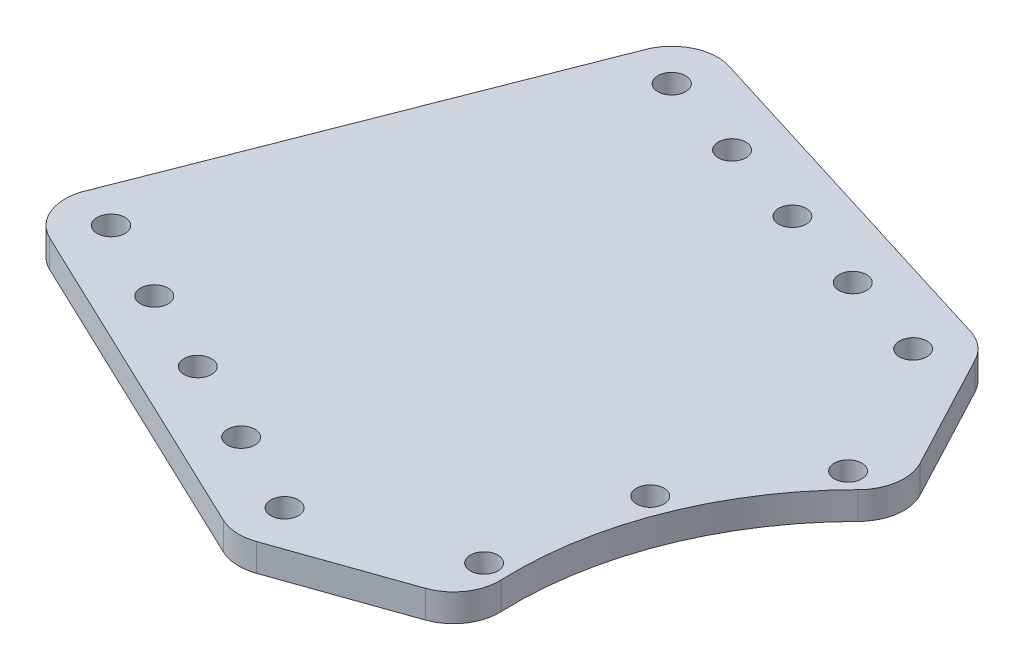
ISO-10303-21;
HEADER;
FILE_DESCRIPTION(('STEP AP214'),'2;1');
FILE_NAME('part.step','',(''),(''),'','','');
FILE_SCHEMA(('AUTOMOTIVE_DESIGN { 1 0 10303 214 1 1 1 1 }'));
ENDSEC;
DATA;
#1=APPLICATION_CONTEXT('core data for automotive mechanical design processes');
#2=APPLICATION_PROTOCOL_DEFINITION('international standard','automotive_design',2000,#1);
#3=PRODUCT_CONTEXT('',#1,'mechanical');
#4=PRODUCT('Part','Part','',(#3));
#5=PRODUCT_RELATED_PRODUCT_CATEGORY('part','',(#4));
#6=PRODUCT_DEFINITION_FORMATION('','',#4);
#7=PRODUCT_DEFINITION_CONTEXT('part definition',#1,'design');
#8=PRODUCT_DEFINITION('design','',#6,#7);
#9=PRODUCT_DEFINITION_SHAPE('','',#8);
#10=(LENGTH_UNIT() NAMED_UNIT(*) SI_UNIT(.MILLI.,.METRE.));
#11=(NAMED_UNIT(*) PLANE_ANGLE_UNIT() SI_UNIT($,.RADIAN.));
#12=(NAMED_UNIT(*) SI_UNIT($,.STERADIAN.) SOLID_ANGLE_UNIT());
#13=UNCERTAINTY_MEASURE_WITH_UNIT(LENGTH_MEASURE(1.E-05),#10,'distance_accuracy_value','');
#14=(GEOMETRIC_REPRESENTATION_CONTEXT(3) GLOBAL_UNCERTAINTY_ASSIGNED_CONTEXT((#13)) GLOBAL_UNIT_ASSIGNED_CONTEXT((#10,
#11,#12)) REPRESENTATION_CONTEXT('',''));
#15=CARTESIAN_POINT('',(0.,0.,0.));
#16=DIRECTION('',(0.,0.,1.));
#17=DIRECTION('',(1.,0.,0.));
#18=AXIS2_PLACEMENT_3D('',#15,#16,#17);
#19=CARTESIAN_POINT('',(-101.704945462718,-9.79999999999935,15.2700175783416));
#20=DIRECTION('',(0.,-1.,0.));
#21=DIRECTION('',(0.,0.,-1.));
#22=AXIS2_PLACEMENT_3D('',#19,#20,#21);
#23=PLANE('',#22);
#24=CARTESIAN_POINT('',(-101.704945462718,-9.79999999999935,15.2700175783416));
#25=DIRECTION('',(0.,1.,0.));
#26=DIRECTION('',(0.,0.,-1.));
#27=AXIS2_PLACEMENT_3D('',#24,#25,#26);
#28=CIRCLE('',#27,5.01371878754549);
#29=CARTESIAN_POINT('',(-106.232366673549,-9.79999999999935,13.1159903593145));
#30=VERTEX_POINT('',#29);
#31=CARTESIAN_POINT('',(-103.858972681745,-9.79999999999935,19.797438789172));
#32=VERTEX_POINT('',#31);
#33=EDGE_CURVE('E187',#30,#32,#28,.T.);
#34=ORIENTED_EDGE('',*,*,#33,.T.);
#35=DIRECTION('',(0.903006610996398,0.,0.429626652451637));
#36=VECTOR('',#35,1.);
#37=CARTESIAN_POINT('',(-67.7502115294627,-9.79999999999932,36.9770319273808));
#38=LINE('',#37,#36);
#39=CARTESIAN_POINT('',(-67.7502115294627,-9.79999999999932,36.9770319273808));
#40=VERTEX_POINT('',#39);
#41=EDGE_CURVE('E115',#32,#40,#38,.T.);
#42=ORIENTED_EDGE('',*,*,#41,.T.);
#43=CARTESIAN_POINT('',(-65.6020782672045,-9.79999999999932,32.4619988723989));
#44=DIRECTION('',(0.,1.,0.));
#45=DIRECTION('',(0.,0.,-1.));
#46=AXIS2_PLACEMENT_3D('',#43,#44,#45);
#47=CIRCLE('',#46,4.99999999999995);
#48=CARTESIAN_POINT('',(-63.9420227974751,-9.79999999999932,37.1783762785678));
#49=VERTEX_POINT('',#48);
#50=EDGE_CURVE('E214',#40,#49,#47,.T.);
#51=ORIENTED_EDGE('',*,*,#50,.T.);
#52=DIRECTION('',(0.9432754812338,0.,-0.332011093945885));
#53=VECTOR('',#52,1.);
#54=CARTESIAN_POINT('',(-50.3329893663854,-9.79999999999932,32.38831211715));
#55=LINE('',#54,#53);
#56=CARTESIAN_POINT('',(-50.3329893663854,-9.79999999999932,32.38831211715));
#57=VERTEX_POINT('',#56);
#58=EDGE_CURVE('E233',#49,#57,#55,.T.);
#59=ORIENTED_EDGE('',*,*,#58,.T.);
#60=CARTESIAN_POINT('',(-51.993044836116,-9.79999999999932,27.6719347109777));
#61=DIRECTION('',(0.,1.,0.));
#62=DIRECTION('',(0.,0.,-1.));
#63=AXIS2_PLACEMENT_3D('',#60,#61,#62);
#64=CIRCLE('',#63,5.0000000000035);
#65=CARTESIAN_POINT('',(-46.9968982868011,-9.79999999999932,27.4756704559436));
#66=VERTEX_POINT('',#65);
#67=EDGE_CURVE('E230',#57,#66,#64,.T.);
#68=ORIENTED_EDGE('',*,*,#67,.T.);
#69=CARTESIAN_POINT('',(-9.52579916696577,-9.79999999999931,26.0036885431889));
#70=DIRECTION('',(0.,-1.,0.));
#71=DIRECTION('',(0.,0.,1.));
#72=AXIS2_PLACEMENT_3D('',#69,#70,#71);
#73=CIRCLE('',#72,37.5000000000001);
#74=CARTESIAN_POINT('',(-36.0579854869404,-9.79999999999934,-0.497124445890421));
#75=VERTEX_POINT('',#74);
#76=EDGE_CURVE('E232',#66,#75,#73,.T.);
#77=ORIENTED_EDGE('',*,*,#76,.T.);
#78=CARTESIAN_POINT('',(-39.5956103296037,-9.79999999999935,-4.03056617776767));
#79=DIRECTION('',(0.,1.,0.));
#80=DIRECTION('',(0.,0.,-1.));
#81=AXIS2_PLACEMENT_3D('',#78,#79,#80);
#82=CIRCLE('',#81,5.00000000000003);
#83=CARTESIAN_POINT('',(-35.1764804281203,-9.79999999999935,-6.36964525163757));
#84=VERTEX_POINT('',#83);
#85=EDGE_CURVE('E235',#75,#84,#82,.T.);
#86=ORIENTED_EDGE('',*,*,#85,.T.);
#87=DIRECTION('',(-0.467815814773978,0.,-0.883825980296664));
#88=VECTOR('',#87,1.);
#89=CARTESIAN_POINT('',(-41.9258566066734,-9.79999999999936,-19.1209756449521));
#90=LINE('',#89,#88);
#91=CARTESIAN_POINT('',(-41.9258566066734,-9.79999999999936,-19.1209756449521));
#92=VERTEX_POINT('',#91);
#93=EDGE_CURVE('E241',#84,#92,#90,.T.);
#94=ORIENTED_EDGE('',*,*,#93,.T.);
#95=CARTESIAN_POINT('',(-46.3449865081567,-9.79999999999936,-16.7818965710823));
#96=DIRECTION('',(0.,1.,0.));
#97=DIRECTION('',(0.,0.,-1.));
#98=AXIS2_PLACEMENT_3D('',#95,#96,#97);
#99=CIRCLE('',#98,4.99999999999996);
#100=CARTESIAN_POINT('',(-44.8603922919088,-9.79999999999936,-21.5564101602432));
#101=VERTEX_POINT('',#100);
#102=EDGE_CURVE('E146',#92,#101,#99,.T.);
#103=ORIENTED_EDGE('',*,*,#102,.T.);
#104=DIRECTION('',(-0.9549027178322,0.,-0.296918843249594));
#105=VECTOR('',#104,1.);
#106=CARTESIAN_POINT('',(-83.044336619652,-9.79999999999939,-33.4293814784511));
#107=LINE('',#106,#105);
#108=CARTESIAN_POINT('',(-83.044336619652,-9.79999999999939,-33.4293814784511));
#109=VERTEX_POINT('',#108);
#110=EDGE_CURVE('E140',#101,#109,#107,.T.);
#111=ORIENTED_EDGE('',*,*,#110,.T.);
#112=CARTESIAN_POINT('',(-84.5289308359,-9.79999999999938,-28.6548678892901));
#113=DIRECTION('',(0.,1.,0.));
#114=DIRECTION('',(0.,0.,-1.));
#115=AXIS2_PLACEMENT_3D('',#112,#113,#114);
#116=CIRCLE('',#115,5.);
#117=CARTESIAN_POINT('',(-89.185537994532,-9.79999999999939,-30.4758593143596));
#118=VERTEX_POINT('',#117);
#119=EDGE_CURVE('E144',#109,#118,#116,.T.);
#120=ORIENTED_EDGE('',*,*,#119,.T.);
#121=DIRECTION('',(-0.364198285013916,0.,0.931321431726406));
#122=VECTOR('',#121,1.);
#123=CARTESIAN_POINT('',(-106.232366673549,-9.79999999999935,13.1159903593145));
#124=LINE('',#123,#122);
#125=EDGE_CURVE('E60',#118,#30,#124,.T.);
#126=ORIENTED_EDGE('',*,*,#125,.T.);
#127=EDGE_LOOP('',(#34,#42,#51,#59,#68,#77,#86,#94,#103,#111,#120,#126));
#128=FACE_BOUND('',#127,.T.);
#129=CARTESIAN_POINT('',(-65.6020782672045,-9.79999999999932,32.4619988723989));
#130=DIRECTION('',(0.,1.,0.));
#131=DIRECTION('',(0.,0.,1.));
#132=AXIS2_PLACEMENT_3D('',#129,#130,#131);
#133=CIRCLE('',#132,1.50000000000001);
#134=CARTESIAN_POINT('',(-65.6020782672045,-9.79999999999932,33.9619988723989));
#135=VERTEX_POINT('',#134);
#136=EDGE_CURVE('E168',#135,#135,#133,.T.);
#137=ORIENTED_EDGE('',*,*,#136,.F.);
#138=EDGE_LOOP('',(#137));
#139=FACE_BOUND('',#138,.T.);
#140=CARTESIAN_POINT('',(-74.6321443771685,-9.79999999999933,28.1657323478825));
#141=DIRECTION('',(0.,1.,0.));
#142=DIRECTION('',(0.,0.,1.));
#143=AXIS2_PLACEMENT_3D('',#140,#141,#142);
#144=CIRCLE('',#143,1.49999999999998);
#145=CARTESIAN_POINT('',(-74.6321443771685,-9.79999999999933,29.6657323478824));
#146=VERTEX_POINT('',#145);
#147=EDGE_CURVE('E395',#146,#146,#144,.T.);
#148=ORIENTED_EDGE('',*,*,#147,.F.);
#149=EDGE_LOOP('',(#148));
#150=FACE_BOUND('',#149,.T.);
#151=CARTESIAN_POINT('',(-83.6622104871345,-9.79999999999934,23.8694658233717));
#152=DIRECTION('',(0.,1.,0.));
#153=DIRECTION('',(0.,0.,1.));
#154=AXIS2_PLACEMENT_3D('',#151,#152,#153);
#155=CIRCLE('',#154,1.49999999999936);
#156=CARTESIAN_POINT('',(-83.6622104871345,-9.79999999999933,25.3694658233711));
#157=VERTEX_POINT('',#156);
#158=EDGE_CURVE('E389',#157,#157,#155,.T.);
#159=ORIENTED_EDGE('',*,*,#158,.F.);
#160=EDGE_LOOP('',(#159));
#161=FACE_BOUND('',#160,.T.);
#162=CARTESIAN_POINT('',(-92.6922765970965,-9.79999999999934,19.5731992988497));
#163=DIRECTION('',(0.,1.,0.));
#164=DIRECTION('',(0.,0.,1.));
#165=AXIS2_PLACEMENT_3D('',#162,#163,#164);
#166=CIRCLE('',#165,1.50000000000003);
#167=CARTESIAN_POINT('',(-92.6922765970965,-9.79999999999934,21.0731992988497));
#168=VERTEX_POINT('',#167);
#169=EDGE_CURVE('E383',#168,#168,#166,.T.);
#170=ORIENTED_EDGE('',*,*,#169,.F.);
#171=EDGE_LOOP('',(#170));
#172=FACE_BOUND('',#171,.T.);
#173=CARTESIAN_POINT('',(-101.704945462718,-9.79999999999935,15.2700175783416));
#174=DIRECTION('',(0.,1.,0.));
#175=DIRECTION('',(0.,0.,1.));
#176=AXIS2_PLACEMENT_3D('',#173,#174,#175);
#177=CIRCLE('',#176,1.51872121914577);
#178=CARTESIAN_POINT('',(-101.704945462718,-9.79999999999935,16.7887387974874));
#179=VERTEX_POINT('',#178);
#180=EDGE_CURVE('E377',#179,#179,#177,.T.);
#181=ORIENTED_EDGE('',*,*,#180,.F.);
#182=EDGE_LOOP('',(#181));
#183=FACE_BOUND('',#182,.T.);
#184=CARTESIAN_POINT('',(-84.5289308359,-9.79999999999938,-28.6548678892901));
#185=DIRECTION('',(0.,1.,0.));
#186=DIRECTION('',(0.,0.,1.));
#187=AXIS2_PLACEMENT_3D('',#184,#185,#186);
#188=CIRCLE('',#187,1.5127388741467);
#189=CARTESIAN_POINT('',(-84.5289308359,-9.79999999999938,-27.1421290151434));
#190=VERTEX_POINT('',#189);
#191=EDGE_CURVE('E371',#190,#190,#188,.T.);
#192=ORIENTED_EDGE('',*,*,#191,.F.);
#193=EDGE_LOOP('',(#192));
#194=FACE_BOUND('',#193,.T.);
#195=CARTESIAN_POINT('',(-74.9920680431228,-9.79999999999938,-25.6894618685701));
#196=DIRECTION('',(0.,1.,0.));
#197=DIRECTION('',(0.,0.,1.));
#198=AXIS2_PLACEMENT_3D('',#195,#196,#197);
#199=CIRCLE('',#198,1.5);
#200=CARTESIAN_POINT('',(-74.9920680431228,-9.79999999999938,-24.1894618685701));
#201=VERTEX_POINT('',#200);
#202=EDGE_CURVE('E365',#201,#201,#199,.T.);
#203=ORIENTED_EDGE('',*,*,#202,.F.);
#204=EDGE_LOOP('',(#203));
#205=FACE_BOUND('',#204,.T.);
#206=CARTESIAN_POINT('',(-65.4430408648008,-9.79999999999937,-22.7202734360741));
#207=DIRECTION('',(0.,1.,0.));
#208=DIRECTION('',(0.,0.,1.));
#209=AXIS2_PLACEMENT_3D('',#206,#207,#208);
#210=CIRCLE('',#209,1.5);
#211=CARTESIAN_POINT('',(-65.4430408648008,-9.79999999999937,-21.2202734360741));
#212=VERTEX_POINT('',#211);
#213=EDGE_CURVE('E359',#212,#212,#210,.T.);
#214=ORIENTED_EDGE('',*,*,#213,.F.);
#215=EDGE_LOOP('',(#214));
#216=FACE_BOUND('',#215,.T.);
#217=CARTESIAN_POINT('',(-55.8940136864788,-9.79999999999937,-19.7510850035782));
#218=DIRECTION('',(0.,1.,0.));
#219=DIRECTION('',(0.,0.,1.));
#220=AXIS2_PLACEMENT_3D('',#217,#218,#219);
#221=CIRCLE('',#220,1.5);
#222=CARTESIAN_POINT('',(-55.8940136864788,-9.79999999999937,-18.2510850035782));
#223=VERTEX_POINT('',#222);
#224=EDGE_CURVE('E353',#223,#223,#221,.T.);
#225=ORIENTED_EDGE('',*,*,#224,.F.);
#226=EDGE_LOOP('',(#225));
#227=FACE_BOUND('',#226,.T.);
#228=CARTESIAN_POINT('',(-46.3449865081567,-9.79999999999936,-16.7818965710823));
#229=DIRECTION('',(0.,1.,0.));
#230=DIRECTION('',(0.,0.,1.));
#231=AXIS2_PLACEMENT_3D('',#228,#229,#230);
#232=CIRCLE('',#231,1.50000000000001);
#233=CARTESIAN_POINT('',(-46.3449865081567,-9.79999999999936,-15.2818965710822));
#234=VERTEX_POINT('',#233);
#235=EDGE_CURVE('E347',#234,#234,#232,.T.);
#236=ORIENTED_EDGE('',*,*,#235,.F.);
#237=EDGE_LOOP('',(#236));
#238=FACE_BOUND('',#237,.T.);
#239=CARTESIAN_POINT('',(-38.3680455345854,-9.79999999999935,-1.71137639394458));
#240=DIRECTION('',(0.,1.,0.));
#241=DIRECTION('',(0.,0.,1.));
#242=AXIS2_PLACEMENT_3D('',#239,#240,#241);
#243=CIRCLE('',#242,1.5);
#244=CARTESIAN_POINT('',(-38.3680455345854,-9.79999999999935,-0.211376393944582));
#245=VERTEX_POINT('',#244);
#246=EDGE_CURVE('E341',#245,#245,#243,.T.);
#247=ORIENTED_EDGE('',*,*,#246,.F.);
#248=EDGE_LOOP('',(#247));
#249=FACE_BOUND('',#248,.T.);
#250=CARTESIAN_POINT('',(-46.7786564360212,-9.79999999999934,11.4357571426303));
#251=DIRECTION('',(0.,1.,0.));
#252=DIRECTION('',(0.,0.,1.));
#253=AXIS2_PLACEMENT_3D('',#250,#251,#252);
#254=CIRCLE('',#253,1.49999999999923);
#255=CARTESIAN_POINT('',(-46.7786564360212,-9.79999999999933,12.9357571426296));
#256=VERTEX_POINT('',#255);
#257=EDGE_CURVE('E335',#256,#256,#254,.T.);
#258=ORIENTED_EDGE('',*,*,#257,.F.);
#259=EDGE_LOOP('',(#258));
#260=FACE_BOUND('',#259,.T.);
#261=CARTESIAN_POINT('',(-49.5178575162354,-9.79999999999932,26.8007261763127));
#262=DIRECTION('',(0.,1.,0.));
#263=DIRECTION('',(0.,0.,1.));
#264=AXIS2_PLACEMENT_3D('',#261,#262,#263);
#265=CIRCLE('',#264,1.49999999999991);
#266=CARTESIAN_POINT('',(-49.5178575162354,-9.79999999999932,28.3007261763127));
#267=VERTEX_POINT('',#266);
#268=EDGE_CURVE('E326',#267,#267,#265,.T.);
#269=ORIENTED_EDGE('',*,*,#268,.F.);
#270=EDGE_LOOP('',(#269));
#271=FACE_BOUND('',#270,.T.);
#272=ADVANCED_FACE('F43',(#128,#139,#150,#161,#172,#183,#194,#205,#216,#227,#238,#249,#260,
#271),#23,.F.);
#273=CARTESIAN_POINT('',(-101.704945462718,-12.7999999999994,15.2700175783416));
#274=DIRECTION('',(0.,-1.,0.));
#275=DIRECTION('',(0.,0.,-1.));
#276=AXIS2_PLACEMENT_3D('',#273,#274,#275);
#277=PLANE('',#276);
#278=CARTESIAN_POINT('',(-46.7786564360212,-12.7999999999993,11.4357571426303));
#279=DIRECTION('',(0.,1.,0.));
#280=DIRECTION('',(0.,0.,1.));
#281=AXIS2_PLACEMENT_3D('',#278,#279,#280);
#282=CIRCLE('',#281,1.49999999999923);
#283=CARTESIAN_POINT('',(-46.7786564360212,-12.7999999999993,12.9357571426296));
#284=VERTEX_POINT('',#283);
#285=EDGE_CURVE('E332',#284,#284,#282,.T.);
#286=ORIENTED_EDGE('',*,*,#285,.T.);
#287=EDGE_LOOP('',(#286));
#288=FACE_BOUND('',#287,.T.);
#289=CARTESIAN_POINT('',(-46.3449865081567,-12.7999999999994,-16.7818965710823));
#290=DIRECTION('',(0.,1.,0.));
#291=DIRECTION('',(0.,0.,1.));
#292=AXIS2_PLACEMENT_3D('',#289,#290,#291);
#293=CIRCLE('',#292,1.50000000000001);
#294=CARTESIAN_POINT('',(-46.3449865081567,-12.7999999999994,-15.2818965710822));
#295=VERTEX_POINT('',#294);
#296=EDGE_CURVE('E344',#295,#295,#293,.T.);
#297=ORIENTED_EDGE('',*,*,#296,.T.);
#298=EDGE_LOOP('',(#297));
#299=FACE_BOUND('',#298,.T.);
#300=CARTESIAN_POINT('',(-65.4430408648008,-12.7999999999994,-22.7202734360741));
#301=DIRECTION('',(0.,1.,0.));
#302=DIRECTION('',(0.,0.,1.));
#303=AXIS2_PLACEMENT_3D('',#300,#301,#302);
#304=CIRCLE('',#303,1.5);
#305=CARTESIAN_POINT('',(-65.4430408648008,-12.7999999999994,-21.2202734360741));
#306=VERTEX_POINT('',#305);
#307=EDGE_CURVE('E356',#306,#306,#304,.T.);
#308=ORIENTED_EDGE('',*,*,#307,.T.);
#309=EDGE_LOOP('',(#308));
#310=FACE_BOUND('',#309,.T.);
#311=CARTESIAN_POINT('',(-84.5289308359,-12.7999999999994,-28.6548678892901));
#312=DIRECTION('',(0.,1.,0.));
#313=DIRECTION('',(0.,0.,1.));
#314=AXIS2_PLACEMENT_3D('',#311,#312,#313);
#315=CIRCLE('',#314,1.5127388741467);
#316=CARTESIAN_POINT('',(-84.5289308359,-12.7999999999994,-27.1421290151434));
#317=VERTEX_POINT('',#316);
#318=EDGE_CURVE('E368',#317,#317,#315,.T.);
#319=ORIENTED_EDGE('',*,*,#318,.T.);
#320=EDGE_LOOP('',(#319));
#321=FACE_BOUND('',#320,.T.);
#322=CARTESIAN_POINT('',(-92.6922765970965,-12.7999999999993,19.5731992988497));
#323=DIRECTION('',(0.,1.,0.));
#324=DIRECTION('',(0.,0.,1.));
#325=AXIS2_PLACEMENT_3D('',#322,#323,#324);
#326=CIRCLE('',#325,1.50000000000003);
#327=CARTESIAN_POINT('',(-92.6922765970965,-12.7999999999993,21.0731992988497));
#328=VERTEX_POINT('',#327);
#329=EDGE_CURVE('E380',#328,#328,#326,.T.);
#330=ORIENTED_EDGE('',*,*,#329,.T.);
#331=EDGE_LOOP('',(#330));
#332=FACE_BOUND('',#331,.T.);
#333=CARTESIAN_POINT('',(-74.6321443771685,-12.7999999999993,28.1657323478825));
#334=DIRECTION('',(0.,1.,0.));
#335=DIRECTION('',(0.,0.,1.));
#336=AXIS2_PLACEMENT_3D('',#333,#334,#335);
#337=CIRCLE('',#336,1.49999999999998);
#338=CARTESIAN_POINT('',(-74.6321443771685,-12.7999999999993,29.6657323478825));
#339=VERTEX_POINT('',#338);
#340=EDGE_CURVE('E392',#339,#339,#337,.T.);
#341=ORIENTED_EDGE('',*,*,#340,.T.);
#342=EDGE_LOOP('',(#341));
#343=FACE_BOUND('',#342,.T.);
#344=CARTESIAN_POINT('',(-101.704945462718,-12.7999999999994,15.2700175783416));
#345=DIRECTION('',(0.,1.,0.));
#346=DIRECTION('',(0.,0.,-1.));
#347=AXIS2_PLACEMENT_3D('',#344,#345,#346);
#348=CIRCLE('',#347,5.01371878754549);
#349=CARTESIAN_POINT('',(-106.232366673549,-12.7999999999994,13.1159903593145));
#350=VERTEX_POINT('',#349);
#351=CARTESIAN_POINT('',(-103.858972681745,-12.7999999999993,19.797438789172));
#352=VERTEX_POINT('',#351);
#353=EDGE_CURVE('E164',#350,#352,#348,.T.);
#354=ORIENTED_EDGE('',*,*,#353,.F.);
#355=DIRECTION('',(-0.364198285013916,0.,0.931321431726406));
#356=VECTOR('',#355,1.);
#357=CARTESIAN_POINT('',(-106.232366673549,-12.7999999999994,13.1159903593145));
#358=LINE('',#357,#356);
#359=CARTESIAN_POINT('',(-89.185537994532,-12.7999999999994,-30.4758593143596));
#360=VERTEX_POINT('',#359);
#361=EDGE_CURVE('E107',#360,#350,#358,.T.);
#362=ORIENTED_EDGE('',*,*,#361,.F.);
#363=CARTESIAN_POINT('',(-84.5289308359,-12.7999999999994,-28.6548678892901));
#364=DIRECTION('',(0.,1.,0.));
#365=DIRECTION('',(0.,0.,-1.));
#366=AXIS2_PLACEMENT_3D('',#363,#364,#365);
#367=CIRCLE('',#366,5.);
#368=CARTESIAN_POINT('',(-83.044336619652,-12.7999999999994,-33.4293814784511));
#369=VERTEX_POINT('',#368);
#370=EDGE_CURVE('E101',#369,#360,#367,.T.);
#371=ORIENTED_EDGE('',*,*,#370,.F.);
#372=DIRECTION('',(-0.9549027178322,0.,-0.296918843249594));
#373=VECTOR('',#372,1.);
#374=CARTESIAN_POINT('',(-83.044336619652,-12.7999999999994,-33.4293814784511));
#375=LINE('',#374,#373);
#376=CARTESIAN_POINT('',(-44.8603922919088,-12.7999999999994,-21.5564101602432));
#377=VERTEX_POINT('',#376);
#378=EDGE_CURVE('E154',#377,#369,#375,.T.);
#379=ORIENTED_EDGE('',*,*,#378,.F.);
#380=CARTESIAN_POINT('',(-46.3449865081567,-12.7999999999994,-16.7818965710823));
#381=DIRECTION('',(0.,1.,0.));
#382=DIRECTION('',(0.,0.,-1.));
#383=AXIS2_PLACEMENT_3D('',#380,#381,#382);
#384=CIRCLE('',#383,4.99999999999996);
#385=CARTESIAN_POINT('',(-41.9258566066734,-12.7999999999994,-19.1209756449521));
#386=VERTEX_POINT('',#385);
#387=EDGE_CURVE('E182',#386,#377,#384,.T.);
#388=ORIENTED_EDGE('',*,*,#387,.F.);
#389=DIRECTION('',(-0.467815814773978,0.,-0.883825980296664));
#390=VECTOR('',#389,1.);
#391=CARTESIAN_POINT('',(-41.9258566066734,-12.7999999999994,-19.1209756449521));
#392=LINE('',#391,#390);
#393=CARTESIAN_POINT('',(-35.1764804281203,-12.7999999999994,-6.36964525163757));
#394=VERTEX_POINT('',#393);
#395=EDGE_CURVE('E180',#394,#386,#392,.T.);
#396=ORIENTED_EDGE('',*,*,#395,.F.);
#397=CARTESIAN_POINT('',(-39.5956103296037,-12.7999999999993,-4.03056617776767));
#398=DIRECTION('',(0.,1.,0.));
#399=DIRECTION('',(0.,0.,-1.));
#400=AXIS2_PLACEMENT_3D('',#397,#398,#399);
#401=CIRCLE('',#400,5.00000000000003);
#402=CARTESIAN_POINT('',(-36.0579854869404,-12.7999999999993,-0.497124445890418));
#403=VERTEX_POINT('',#402);
#404=EDGE_CURVE('E178',#403,#394,#401,.T.);
#405=ORIENTED_EDGE('',*,*,#404,.F.);
#406=CARTESIAN_POINT('',(-9.52579916696577,-12.7999999999993,26.0036885431889));
#407=DIRECTION('',(0.,-1.,0.));
#408=DIRECTION('',(0.,0.,1.));
#409=AXIS2_PLACEMENT_3D('',#406,#407,#408);
#410=CIRCLE('',#409,37.5000000000001);
#411=CARTESIAN_POINT('',(-46.9968982868011,-12.7999999999993,27.4756704559436));
#412=VERTEX_POINT('',#411);
#413=EDGE_CURVE('E176',#412,#403,#410,.T.);
#414=ORIENTED_EDGE('',*,*,#413,.F.);
#415=CARTESIAN_POINT('',(-51.993044836116,-12.7999999999993,27.6719347109777));
#416=DIRECTION('',(0.,1.,0.));
#417=DIRECTION('',(0.,0.,-1.));
#418=AXIS2_PLACEMENT_3D('',#415,#416,#417);
#419=CIRCLE('',#418,5.0000000000035);
#420=CARTESIAN_POINT('',(-50.3329893663854,-12.7999999999993,32.38831211715));
#421=VERTEX_POINT('',#420);
#422=EDGE_CURVE('E174',#421,#412,#419,.T.);
#423=ORIENTED_EDGE('',*,*,#422,.F.);
#424=DIRECTION('',(0.9432754812338,0.,-0.332011093945885));
#425=VECTOR('',#424,1.);
#426=CARTESIAN_POINT('',(-50.3329893663854,-12.7999999999993,32.38831211715));
#427=LINE('',#426,#425);
#428=CARTESIAN_POINT('',(-63.9420227974751,-12.7999999999993,37.1783762785678));
#429=VERTEX_POINT('',#428);
#430=EDGE_CURVE('E172',#429,#421,#427,.T.);
#431=ORIENTED_EDGE('',*,*,#430,.F.);
#432=CARTESIAN_POINT('',(-65.6020782672045,-12.7999999999993,32.4619988723989));
#433=DIRECTION('',(0.,1.,0.));
#434=DIRECTION('',(0.,0.,-1.));
#435=AXIS2_PLACEMENT_3D('',#432,#433,#434);
#436=CIRCLE('',#435,4.99999999999995);
#437=CARTESIAN_POINT('',(-67.7502115294627,-12.7999999999993,36.9770319273808));
#438=VERTEX_POINT('',#437);
#439=EDGE_CURVE('E170',#438,#429,#436,.T.);
#440=ORIENTED_EDGE('',*,*,#439,.F.);
#441=DIRECTION('',(0.903006610996398,0.,0.429626652451637));
#442=VECTOR('',#441,1.);
#443=CARTESIAN_POINT('',(-67.7502115294627,-12.7999999999993,36.9770319273808));
#444=LINE('',#443,#442);
#445=EDGE_CURVE('E167',#352,#438,#444,.T.);
#446=ORIENTED_EDGE('',*,*,#445,.F.);
#447=EDGE_LOOP('',(#354,#362,#371,#379,#388,#396,#405,#414,#423,#431,#440,#446));
#448=FACE_BOUND('',#447,.T.);
#449=CARTESIAN_POINT('',(-65.6020782672045,-12.7999999999993,32.4619988723989));
#450=DIRECTION('',(0.,1.,0.));
#451=DIRECTION('',(0.,0.,1.));
#452=AXIS2_PLACEMENT_3D('',#449,#450,#451);
#453=CIRCLE('',#452,1.50000000000001);
#454=CARTESIAN_POINT('',(-65.6020782672045,-12.7999999999993,33.9619988723989));
#455=VERTEX_POINT('',#454);
#456=EDGE_CURVE('E398',#455,#455,#453,.T.);
#457=ORIENTED_EDGE('',*,*,#456,.T.);
#458=EDGE_LOOP('',(#457));
#459=FACE_BOUND('',#458,.T.);
#460=CARTESIAN_POINT('',(-83.6622104871345,-12.7999999999993,23.8694658233717));
#461=DIRECTION('',(0.,1.,0.));
#462=DIRECTION('',(0.,0.,1.));
#463=AXIS2_PLACEMENT_3D('',#460,#461,#462);
#464=CIRCLE('',#463,1.49999999999936);
#465=CARTESIAN_POINT('',(-83.6622104871345,-12.7999999999993,25.3694658233711));
#466=VERTEX_POINT('',#465);
#467=EDGE_CURVE('E386',#466,#466,#464,.T.);
#468=ORIENTED_EDGE('',*,*,#467,.T.);
#469=EDGE_LOOP('',(#468));
#470=FACE_BOUND('',#469,.T.);
#471=CARTESIAN_POINT('',(-101.704945462718,-12.7999999999994,15.2700175783416));
#472=DIRECTION('',(0.,1.,0.));
#473=DIRECTION('',(0.,0.,1.));
#474=AXIS2_PLACEMENT_3D('',#471,#472,#473);
#475=CIRCLE('',#474,1.51872121914577);
#476=CARTESIAN_POINT('',(-101.704945462718,-12.7999999999993,16.7887387974874));
#477=VERTEX_POINT('',#476);
#478=EDGE_CURVE('E374',#477,#477,#475,.T.);
#479=ORIENTED_EDGE('',*,*,#478,.T.);
#480=EDGE_LOOP('',(#479));
#481=FACE_BOUND('',#480,.T.);
#482=CARTESIAN_POINT('',(-74.9920680431228,-12.7999999999994,-25.6894618685701));
#483=DIRECTION('',(0.,1.,0.));
#484=DIRECTION('',(0.,0.,1.));
#485=AXIS2_PLACEMENT_3D('',#482,#483,#484);
#486=CIRCLE('',#485,1.5);
#487=CARTESIAN_POINT('',(-74.9920680431228,-12.7999999999994,-24.1894618685701));
#488=VERTEX_POINT('',#487);
#489=EDGE_CURVE('E362',#488,#488,#486,.T.);
#490=ORIENTED_EDGE('',*,*,#489,.T.);
#491=EDGE_LOOP('',(#490));
#492=FACE_BOUND('',#491,.T.);
#493=CARTESIAN_POINT('',(-55.8940136864788,-12.7999999999994,-19.7510850035782));
#494=DIRECTION('',(0.,1.,0.));
#495=DIRECTION('',(0.,0.,1.));
#496=AXIS2_PLACEMENT_3D('',#493,#494,#495);
#497=CIRCLE('',#496,1.5);
#498=CARTESIAN_POINT('',(-55.8940136864788,-12.7999999999994,-18.2510850035782));
#499=VERTEX_POINT('',#498);
#500=EDGE_CURVE('E350',#499,#499,#497,.T.);
#501=ORIENTED_EDGE('',*,*,#500,.T.);
#502=EDGE_LOOP('',(#501));
#503=FACE_BOUND('',#502,.T.);
#504=CARTESIAN_POINT('',(-38.3680455345854,-12.7999999999993,-1.71137639394458));
#505=DIRECTION('',(0.,1.,0.));
#506=DIRECTION('',(0.,0.,1.));
#507=AXIS2_PLACEMENT_3D('',#504,#505,#506);
#508=CIRCLE('',#507,1.5);
#509=CARTESIAN_POINT('',(-38.3680455345854,-12.7999999999993,-0.211376393944579));
#510=VERTEX_POINT('',#509);
#511=EDGE_CURVE('E338',#510,#510,#508,.T.);
#512=ORIENTED_EDGE('',*,*,#511,.T.);
#513=EDGE_LOOP('',(#512));
#514=FACE_BOUND('',#513,.T.);
#515=CARTESIAN_POINT('',(-49.5178575162354,-12.7999999999993,26.8007261763127));
#516=DIRECTION('',(0.,1.,0.));
#517=DIRECTION('',(0.,0.,1.));
#518=AXIS2_PLACEMENT_3D('',#515,#516,#517);
#519=CIRCLE('',#518,1.49999999999991);
#520=CARTESIAN_POINT('',(-49.5178575162354,-12.7999999999993,28.3007261763127));
#521=VERTEX_POINT('',#520);
#522=EDGE_CURVE('E329',#521,#521,#519,.T.);
#523=ORIENTED_EDGE('',*,*,#522,.T.);
#524=EDGE_LOOP('',(#523));
#525=FACE_BOUND('',#524,.T.);
#526=ADVANCED_FACE('F218',(#288,#299,#310,#321,#332,#343,#448,#459,#470,#481,#492,#503,#514,
#525),#277,.T.);
#527=CARTESIAN_POINT('',(-101.704945462718,-9.79999999999935,15.2700175783416));
#528=DIRECTION('',(0.,-1.,0.));
#529=DIRECTION('',(0.,0.,-1.));
#530=AXIS2_PLACEMENT_3D('',#527,#528,#529);
#531=CYLINDRICAL_SURFACE('',#530,5.01371878754549);
#532=ORIENTED_EDGE('',*,*,#353,.T.);
#533=DIRECTION('',(0.,-1.,0.));
#534=VECTOR('',#533,1.);
#535=CARTESIAN_POINT('',(-103.858972681745,-9.79999999999935,19.797438789172));
#536=LINE('',#535,#534);
#537=EDGE_CURVE('E11',#32,#352,#536,.T.);
#538=ORIENTED_EDGE('',*,*,#537,.F.);
#539=ORIENTED_EDGE('',*,*,#33,.F.);
#540=DIRECTION('',(0.,-1.,0.));
#541=VECTOR('',#540,1.);
#542=CARTESIAN_POINT('',(-106.232366673549,-9.79999999999935,13.1159903593145));
#543=LINE('',#542,#541);
#544=EDGE_CURVE('E160',#30,#350,#543,.T.);
#545=ORIENTED_EDGE('',*,*,#544,.T.);
#546=EDGE_LOOP('',(#532,#538,#539,#545));
#547=FACE_BOUND('',#546,.T.);
#548=ADVANCED_FACE('F45',(#547),#531,.T.);
#549=CARTESIAN_POINT('',(-67.7502115294627,-9.79999999999932,36.9770319273808));
#550=DIRECTION('',(0.429626652451637,0.,-0.903006610996398));
#551=DIRECTION('',(-0.903006610996398,0.,-0.429626652451637));
#552=AXIS2_PLACEMENT_3D('',#549,#550,#551);
#553=PLANE('',#552);
#554=ORIENTED_EDGE('',*,*,#445,.T.);
#555=DIRECTION('',(0.,-1.,0.));
#556=VECTOR('',#555,1.);
#557=CARTESIAN_POINT('',(-67.7502115294627,-9.79999999999932,36.9770319273808));
#558=LINE('',#557,#556);
#559=EDGE_CURVE('E52',#40,#438,#558,.T.);
#560=ORIENTED_EDGE('',*,*,#559,.F.);
#561=ORIENTED_EDGE('',*,*,#41,.F.);
#562=ORIENTED_EDGE('',*,*,#537,.T.);
#563=EDGE_LOOP('',(#554,#560,#561,#562));
#564=FACE_BOUND('',#563,.T.);
#565=ADVANCED_FACE('F604',(#564),#553,.F.);
#566=CARTESIAN_POINT('',(-65.6020782672045,-9.79999999999932,32.4619988723989));
#567=DIRECTION('',(0.,-1.,0.));
#568=DIRECTION('',(0.,0.,-1.));
#569=AXIS2_PLACEMENT_3D('',#566,#567,#568);
#570=CYLINDRICAL_SURFACE('',#569,4.99999999999995);
#571=ORIENTED_EDGE('',*,*,#439,.T.);
#572=DIRECTION('',(0.,-1.,0.));
#573=VECTOR('',#572,1.);
#574=CARTESIAN_POINT('',(-63.9420227974751,-9.79999999999932,37.1783762785678));
#575=LINE('',#574,#573);
#576=EDGE_CURVE('E206',#49,#429,#575,.T.);
#577=ORIENTED_EDGE('',*,*,#576,.F.);
#578=ORIENTED_EDGE('',*,*,#50,.F.);
#579=ORIENTED_EDGE('',*,*,#559,.T.);
#580=EDGE_LOOP('',(#571,#577,#578,#579));
#581=FACE_BOUND('',#580,.T.);
#582=ADVANCED_FACE('F212',(#581),#570,.T.);
#583=CARTESIAN_POINT('',(-50.3329893663854,-9.79999999999932,32.38831211715));
#584=DIRECTION('',(-0.332011093945885,0.,-0.9432754812338));
#585=DIRECTION('',(-0.9432754812338,0.,0.332011093945885));
#586=AXIS2_PLACEMENT_3D('',#583,#584,#585);
#587=PLANE('',#586);
#588=ORIENTED_EDGE('',*,*,#430,.T.);
#589=DIRECTION('',(0.,-1.,0.));
#590=VECTOR('',#589,1.);
#591=CARTESIAN_POINT('',(-50.3329893663854,-9.79999999999932,32.38831211715));
#592=LINE('',#591,#590);
#593=EDGE_CURVE('E203',#57,#421,#592,.T.);
#594=ORIENTED_EDGE('',*,*,#593,.F.);
#595=ORIENTED_EDGE('',*,*,#58,.F.);
#596=ORIENTED_EDGE('',*,*,#576,.T.);
#597=EDGE_LOOP('',(#588,#594,#595,#596));
#598=FACE_BOUND('',#597,.T.);
#599=ADVANCED_FACE('F224',(#598),#587,.F.);
#600=CARTESIAN_POINT('',(-51.993044836116,-9.79999999999932,27.6719347109777));
#601=DIRECTION('',(0.,-1.,0.));
#602=DIRECTION('',(0.,0.,-1.));
#603=AXIS2_PLACEMENT_3D('',#600,#601,#602);
#604=CYLINDRICAL_SURFACE('',#603,5.0000000000035);
#605=ORIENTED_EDGE('',*,*,#422,.T.);
#606=DIRECTION('',(0.,-1.,0.));
#607=VECTOR('',#606,1.);
#608=CARTESIAN_POINT('',(-46.9968982868011,-9.79999999999932,27.4756704559436));
#609=LINE('',#608,#607);
#610=EDGE_CURVE('E200',#66,#412,#609,.T.);
#611=ORIENTED_EDGE('',*,*,#610,.F.);
#612=ORIENTED_EDGE('',*,*,#67,.F.);
#613=ORIENTED_EDGE('',*,*,#593,.T.);
#614=EDGE_LOOP('',(#605,#611,#612,#613));
#615=FACE_BOUND('',#614,.T.);
#616=ADVANCED_FACE('F228',(#615),#604,.T.);
#617=CARTESIAN_POINT('',(-9.52579916696577,-9.79999999999931,26.0036885431889));
#618=DIRECTION('',(0.,-1.,0.));
#619=DIRECTION('',(0.,0.,-1.));
#620=AXIS2_PLACEMENT_3D('',#617,#618,#619);
#621=CYLINDRICAL_SURFACE('',#620,37.5000000000001);
#622=ORIENTED_EDGE('',*,*,#413,.T.);
#623=DIRECTION('',(0.,-1.,0.));
#624=VECTOR('',#623,1.);
#625=CARTESIAN_POINT('',(-36.0579854869404,-9.79999999999934,-0.497124445890421));
#626=LINE('',#625,#624);
#627=EDGE_CURVE('E197',#75,#403,#626,.T.);
#628=ORIENTED_EDGE('',*,*,#627,.F.);
#629=ORIENTED_EDGE('',*,*,#76,.F.);
#630=ORIENTED_EDGE('',*,*,#610,.T.);
#631=EDGE_LOOP('',(#622,#628,#629,#630));
#632=FACE_BOUND('',#631,.T.);
#633=ADVANCED_FACE('F569',(#632),#621,.F.);
#634=CARTESIAN_POINT('',(-39.5956103296037,-9.79999999999935,-4.03056617776767));
#635=DIRECTION('',(0.,-1.,0.));
#636=DIRECTION('',(0.,0.,-1.));
#637=AXIS2_PLACEMENT_3D('',#634,#635,#636);
#638=CYLINDRICAL_SURFACE('',#637,5.00000000000003);
#639=ORIENTED_EDGE('',*,*,#404,.T.);
#640=DIRECTION('',(0.,-1.,0.));
#641=VECTOR('',#640,1.);
#642=CARTESIAN_POINT('',(-35.1764804281203,-9.79999999999935,-6.36964525163757));
#643=LINE('',#642,#641);
#644=EDGE_CURVE('E194',#84,#394,#643,.T.);
#645=ORIENTED_EDGE('',*,*,#644,.F.);
#646=ORIENTED_EDGE('',*,*,#85,.F.);
#647=ORIENTED_EDGE('',*,*,#627,.T.);
#648=EDGE_LOOP('',(#639,#645,#646,#647));
#649=FACE_BOUND('',#648,.T.);
#650=ADVANCED_FACE('F560',(#649),#638,.T.);
#651=CARTESIAN_POINT('',(-41.9258566066734,-9.79999999999936,-19.1209756449521));
#652=DIRECTION('',(-0.883825980296664,0.,0.467815814773978));
#653=DIRECTION('',(0.467815814773978,0.,0.883825980296664));
#654=AXIS2_PLACEMENT_3D('',#651,#652,#653);
#655=PLANE('',#654);
#656=ORIENTED_EDGE('',*,*,#395,.T.);
#657=DIRECTION('',(0.,-1.,0.));
#658=VECTOR('',#657,1.);
#659=CARTESIAN_POINT('',(-41.9258566066734,-9.79999999999936,-19.1209756449521));
#660=LINE('',#659,#658);
#661=EDGE_CURVE('E191',#92,#386,#660,.T.);
#662=ORIENTED_EDGE('',*,*,#661,.F.);
#663=ORIENTED_EDGE('',*,*,#93,.F.);
#664=ORIENTED_EDGE('',*,*,#644,.T.);
#665=EDGE_LOOP('',(#656,#662,#663,#664));
#666=FACE_BOUND('',#665,.T.);
#667=ADVANCED_FACE('F247',(#666),#655,.F.);
#668=CARTESIAN_POINT('',(-46.3449865081567,-9.79999999999936,-16.7818965710823));
#669=DIRECTION('',(0.,-1.,0.));
#670=DIRECTION('',(0.,0.,-1.));
#671=AXIS2_PLACEMENT_3D('',#668,#669,#670);
#672=CYLINDRICAL_SURFACE('',#671,4.99999999999996);
#673=ORIENTED_EDGE('',*,*,#387,.T.);
#674=DIRECTION('',(0.,-1.,0.));
#675=VECTOR('',#674,1.);
#676=CARTESIAN_POINT('',(-44.8603922919088,-9.79999999999936,-21.5564101602432));
#677=LINE('',#676,#675);
#678=EDGE_CURVE('E155',#101,#377,#677,.T.);
#679=ORIENTED_EDGE('',*,*,#678,.F.);
#680=ORIENTED_EDGE('',*,*,#102,.F.);
#681=ORIENTED_EDGE('',*,*,#661,.T.);
#682=EDGE_LOOP('',(#673,#679,#680,#681));
#683=FACE_BOUND('',#682,.T.);
#684=ADVANCED_FACE('F251',(#683),#672,.T.);
#685=CARTESIAN_POINT('',(-83.044336619652,-9.79999999999939,-33.4293814784511));
#686=DIRECTION('',(-0.296918843249594,0.,0.9549027178322));
#687=DIRECTION('',(0.9549027178322,0.,0.296918843249594));
#688=AXIS2_PLACEMENT_3D('',#685,#686,#687);
#689=PLANE('',#688);
#690=ORIENTED_EDGE('',*,*,#378,.T.);
#691=DIRECTION('',(0.,-1.,0.));
#692=VECTOR('',#691,1.);
#693=CARTESIAN_POINT('',(-83.044336619652,-9.79999999999939,-33.4293814784511));
#694=LINE('',#693,#692);
#695=EDGE_CURVE('E151',#109,#369,#694,.T.);
#696=ORIENTED_EDGE('',*,*,#695,.F.);
#697=ORIENTED_EDGE('',*,*,#110,.F.);
#698=ORIENTED_EDGE('',*,*,#678,.T.);
#699=EDGE_LOOP('',(#690,#696,#697,#698));
#700=FACE_BOUND('',#699,.T.);
#701=ADVANCED_FACE('F152',(#700),#689,.F.);
#702=CARTESIAN_POINT('',(-84.5289308359,-9.79999999999938,-28.6548678892901));
#703=DIRECTION('',(0.,-1.,0.));
#704=DIRECTION('',(0.,0.,-1.));
#705=AXIS2_PLACEMENT_3D('',#702,#703,#704);
#706=CYLINDRICAL_SURFACE('',#705,5.);
#707=ORIENTED_EDGE('',*,*,#370,.T.);
#708=DIRECTION('',(0.,-1.,0.));
#709=VECTOR('',#708,1.);
#710=CARTESIAN_POINT('',(-89.185537994532,-9.79999999999939,-30.4758593143596));
#711=LINE('',#710,#709);
#712=EDGE_CURVE('E156',#118,#360,#711,.T.);
#713=ORIENTED_EDGE('',*,*,#712,.F.);
#714=ORIENTED_EDGE('',*,*,#119,.F.);
#715=ORIENTED_EDGE('',*,*,#695,.T.);
#716=EDGE_LOOP('',(#707,#713,#714,#715));
#717=FACE_BOUND('',#716,.T.);
#718=ADVANCED_FACE('F158',(#717),#706,.T.);
#719=CARTESIAN_POINT('',(-106.232366673549,-9.79999999999935,13.1159903593145));
#720=DIRECTION('',(0.931321431726406,0.,0.364198285013916));
#721=DIRECTION('',(0.364198285013916,0.,-0.931321431726406));
#722=AXIS2_PLACEMENT_3D('',#719,#720,#721);
#723=PLANE('',#722);
#724=ORIENTED_EDGE('',*,*,#361,.T.);
#725=ORIENTED_EDGE('',*,*,#544,.F.);
#726=ORIENTED_EDGE('',*,*,#125,.F.);
#727=ORIENTED_EDGE('',*,*,#712,.T.);
#728=EDGE_LOOP('',(#724,#725,#726,#727));
#729=FACE_BOUND('',#728,.T.);
#730=ADVANCED_FACE('F255',(#729),#723,.F.);
#731=CARTESIAN_POINT('',(-65.6020782672045,-9.79999999999932,32.4619988723989));
#732=DIRECTION('',(0.,-1.,0.));
#733=DIRECTION('',(0.,0.,-1.));
#734=AXIS2_PLACEMENT_3D('',#731,#732,#733);
#735=CYLINDRICAL_SURFACE('',#734,1.50000000000001);
#736=ORIENTED_EDGE('',*,*,#136,.T.);
#737=EDGE_LOOP('',(#736));
#738=FACE_BOUND('',#737,.T.);
#739=ORIENTED_EDGE('',*,*,#456,.F.);
#740=EDGE_LOOP('',(#739));
#741=FACE_BOUND('',#740,.T.);
#742=ADVANCED_FACE('F257',(#738,#741),#735,.F.);
#743=CARTESIAN_POINT('',(-74.6321443771685,-9.79999999999933,28.1657323478825));
#744=DIRECTION('',(0.,-1.,0.));
#745=DIRECTION('',(0.,0.,-1.));
#746=AXIS2_PLACEMENT_3D('',#743,#744,#745);
#747=CYLINDRICAL_SURFACE('',#746,1.49999999999998);
#748=ORIENTED_EDGE('',*,*,#147,.T.);
#749=EDGE_LOOP('',(#748));
#750=FACE_BOUND('',#749,.T.);
#751=ORIENTED_EDGE('',*,*,#340,.F.);
#752=EDGE_LOOP('',(#751));
#753=FACE_BOUND('',#752,.T.);
#754=ADVANCED_FACE('F263',(#750,#753),#747,.F.);
#755=CARTESIAN_POINT('',(-83.6622104871345,-9.79999999999934,23.8694658233717));
#756=DIRECTION('',(0.,-1.,0.));
#757=DIRECTION('',(0.,0.,-1.));
#758=AXIS2_PLACEMENT_3D('',#755,#756,#757);
#759=CYLINDRICAL_SURFACE('',#758,1.49999999999936);
#760=ORIENTED_EDGE('',*,*,#158,.T.);
#761=EDGE_LOOP('',(#760));
#762=FACE_BOUND('',#761,.T.);
#763=ORIENTED_EDGE('',*,*,#467,.F.);
#764=EDGE_LOOP('',(#763));
#765=FACE_BOUND('',#764,.T.);
#766=ADVANCED_FACE('F277',(#762,#765),#759,.F.);
#767=CARTESIAN_POINT('',(-92.6922765970965,-9.79999999999934,19.5731992988497));
#768=DIRECTION('',(0.,-1.,0.));
#769=DIRECTION('',(0.,0.,-1.));
#770=AXIS2_PLACEMENT_3D('',#767,#768,#769);
#771=CYLINDRICAL_SURFACE('',#770,1.50000000000003);
#772=ORIENTED_EDGE('',*,*,#169,.T.);
#773=EDGE_LOOP('',(#772));
#774=FACE_BOUND('',#773,.T.);
#775=ORIENTED_EDGE('',*,*,#329,.F.);
#776=EDGE_LOOP('',(#775));
#777=FACE_BOUND('',#776,.T.);
#778=ADVANCED_FACE('F281',(#774,#777),#771,.F.);
#779=CARTESIAN_POINT('',(-101.704945462718,-9.79999999999935,15.2700175783416));
#780=DIRECTION('',(0.,-1.,0.));
#781=DIRECTION('',(0.,0.,-1.));
#782=AXIS2_PLACEMENT_3D('',#779,#780,#781);
#783=CYLINDRICAL_SURFACE('',#782,1.51872121914577);
#784=ORIENTED_EDGE('',*,*,#180,.T.);
#785=EDGE_LOOP('',(#784));
#786=FACE_BOUND('',#785,.T.);
#787=ORIENTED_EDGE('',*,*,#478,.F.);
#788=EDGE_LOOP('',(#787));
#789=FACE_BOUND('',#788,.T.);
#790=ADVANCED_FACE('F285',(#786,#789),#783,.F.);
#791=CARTESIAN_POINT('',(-84.5289308359,-9.79999999999938,-28.6548678892901));
#792=DIRECTION('',(0.,-1.,0.));
#793=DIRECTION('',(0.,0.,-1.));
#794=AXIS2_PLACEMENT_3D('',#791,#792,#793);
#795=CYLINDRICAL_SURFACE('',#794,1.5127388741467);
#796=ORIENTED_EDGE('',*,*,#191,.T.);
#797=EDGE_LOOP('',(#796));
#798=FACE_BOUND('',#797,.T.);
#799=ORIENTED_EDGE('',*,*,#318,.F.);
#800=EDGE_LOOP('',(#799));
#801=FACE_BOUND('',#800,.T.);
#802=ADVANCED_FACE('F289',(#798,#801),#795,.F.);
#803=CARTESIAN_POINT('',(-74.9920680431228,-9.79999999999938,-25.6894618685701));
#804=DIRECTION('',(0.,-1.,0.));
#805=DIRECTION('',(0.,0.,-1.));
#806=AXIS2_PLACEMENT_3D('',#803,#804,#805);
#807=CYLINDRICAL_SURFACE('',#806,1.5);
#808=ORIENTED_EDGE('',*,*,#202,.T.);
#809=EDGE_LOOP('',(#808));
#810=FACE_BOUND('',#809,.T.);
#811=ORIENTED_EDGE('',*,*,#489,.F.);
#812=EDGE_LOOP('',(#811));
#813=FACE_BOUND('',#812,.T.);
#814=ADVANCED_FACE('F293',(#810,#813),#807,.F.);
#815=CARTESIAN_POINT('',(-65.4430408648008,-9.79999999999937,-22.7202734360741));
#816=DIRECTION('',(0.,-1.,0.));
#817=DIRECTION('',(0.,0.,-1.));
#818=AXIS2_PLACEMENT_3D('',#815,#816,#817);
#819=CYLINDRICAL_SURFACE('',#818,1.5);
#820=ORIENTED_EDGE('',*,*,#213,.T.);
#821=EDGE_LOOP('',(#820));
#822=FACE_BOUND('',#821,.T.);
#823=ORIENTED_EDGE('',*,*,#307,.F.);
#824=EDGE_LOOP('',(#823));
#825=FACE_BOUND('',#824,.T.);
#826=ADVANCED_FACE('F297',(#822,#825),#819,.F.);
#827=CARTESIAN_POINT('',(-55.8940136864788,-9.79999999999937,-19.7510850035782));
#828=DIRECTION('',(0.,-1.,0.));
#829=DIRECTION('',(0.,0.,-1.));
#830=AXIS2_PLACEMENT_3D('',#827,#828,#829);
#831=CYLINDRICAL_SURFACE('',#830,1.5);
#832=ORIENTED_EDGE('',*,*,#224,.T.);
#833=EDGE_LOOP('',(#832));
#834=FACE_BOUND('',#833,.T.);
#835=ORIENTED_EDGE('',*,*,#500,.F.);
#836=EDGE_LOOP('',(#835));
#837=FACE_BOUND('',#836,.T.);
#838=ADVANCED_FACE('F301',(#834,#837),#831,.F.);
#839=CARTESIAN_POINT('',(-46.3449865081567,-9.79999999999936,-16.7818965710823));
#840=DIRECTION('',(0.,-1.,0.));
#841=DIRECTION('',(0.,0.,-1.));
#842=AXIS2_PLACEMENT_3D('',#839,#840,#841);
#843=CYLINDRICAL_SURFACE('',#842,1.50000000000001);
#844=ORIENTED_EDGE('',*,*,#235,.T.);
#845=EDGE_LOOP('',(#844));
#846=FACE_BOUND('',#845,.T.);
#847=ORIENTED_EDGE('',*,*,#296,.F.);
#848=EDGE_LOOP('',(#847));
#849=FACE_BOUND('',#848,.T.);
#850=ADVANCED_FACE('F305',(#846,#849),#843,.F.);
#851=CARTESIAN_POINT('',(-38.3680455345854,-9.79999999999935,-1.71137639394458));
#852=DIRECTION('',(0.,-1.,0.));
#853=DIRECTION('',(0.,0.,-1.));
#854=AXIS2_PLACEMENT_3D('',#851,#852,#853);
#855=CYLINDRICAL_SURFACE('',#854,1.5);
#856=ORIENTED_EDGE('',*,*,#246,.T.);
#857=EDGE_LOOP('',(#856));
#858=FACE_BOUND('',#857,.T.);
#859=ORIENTED_EDGE('',*,*,#511,.F.);
#860=EDGE_LOOP('',(#859));
#861=FACE_BOUND('',#860,.T.);
#862=ADVANCED_FACE('F309',(#858,#861),#855,.F.);
#863=CARTESIAN_POINT('',(-46.7786564360212,-9.79999999999934,11.4357571426303));
#864=DIRECTION('',(0.,-1.,0.));
#865=DIRECTION('',(0.,0.,-1.));
#866=AXIS2_PLACEMENT_3D('',#863,#864,#865);
#867=CYLINDRICAL_SURFACE('',#866,1.49999999999923);
#868=ORIENTED_EDGE('',*,*,#257,.T.);
#869=EDGE_LOOP('',(#868));
#870=FACE_BOUND('',#869,.T.);
#871=ORIENTED_EDGE('',*,*,#285,.F.);
#872=EDGE_LOOP('',(#871));
#873=FACE_BOUND('',#872,.T.);
#874=ADVANCED_FACE('F313',(#870,#873),#867,.F.);
#875=CARTESIAN_POINT('',(-49.5178575162354,-9.79999999999932,26.8007261763127));
#876=DIRECTION('',(0.,-1.,0.));
#877=DIRECTION('',(0.,0.,-1.));
#878=AXIS2_PLACEMENT_3D('',#875,#876,#877);
#879=CYLINDRICAL_SURFACE('',#878,1.49999999999991);
#880=ORIENTED_EDGE('',*,*,#268,.T.);
#881=EDGE_LOOP('',(#880));
#882=FACE_BOUND('',#881,.T.);
#883=ORIENTED_EDGE('',*,*,#522,.F.);
#884=EDGE_LOOP('',(#883));
#885=FACE_BOUND('',#884,.T.);
#886=ADVANCED_FACE('F317',(#882,#885),#879,.F.);
#887=CLOSED_SHELL('',(#272,#526,#548,#565,#582,#599,#616,#633,#650,#667,#684,#701,#718,#730,
#742,#754,#766,#778,#790,#802,#814,#826,#838,#850,#862,#874,#886));
#888=MANIFOLD_SOLID_BREP('B2',#887);
#889=ADVANCED_BREP_SHAPE_REPRESENTATION('',(#18,#888),#14);
#890=SHAPE_DEFINITION_REPRESENTATION(#9,#889);
ENDSEC;
END-ISO-10303-21;
